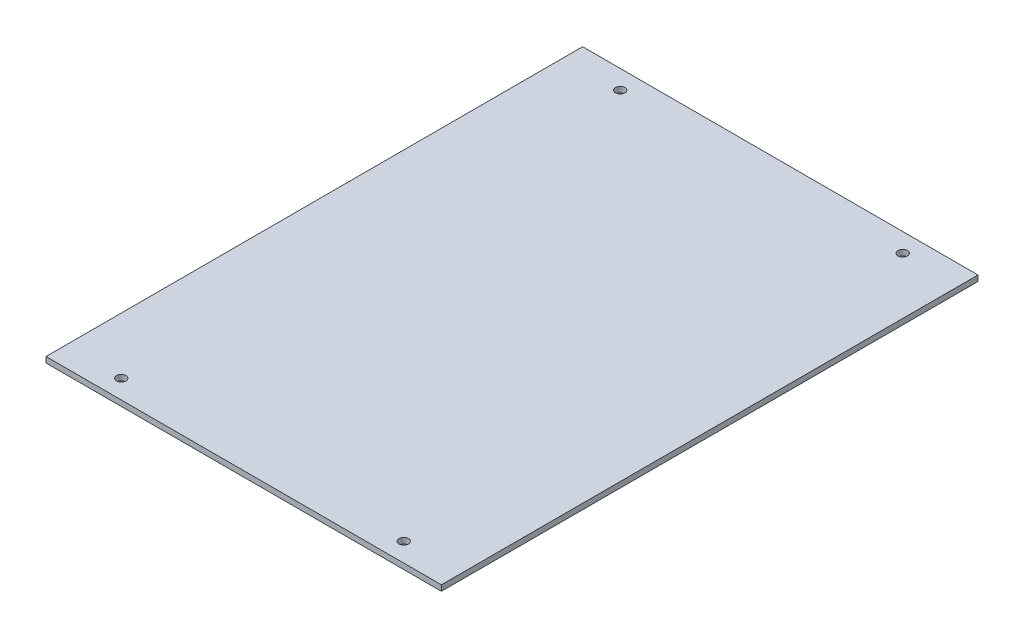
ISO-10303-21;
HEADER;
FILE_DESCRIPTION(('STEP AP214'),'2;1');
FILE_NAME('part.step','',(''),(''),'','','');
FILE_SCHEMA(('AUTOMOTIVE_DESIGN { 1 0 10303 214 1 1 1 1 }'));
ENDSEC;
DATA;
#1=APPLICATION_CONTEXT('core data for automotive mechanical design processes');
#2=APPLICATION_PROTOCOL_DEFINITION('international standard','automotive_design',2000,#1);
#3=PRODUCT_CONTEXT('',#1,'mechanical');
#4=PRODUCT('Part','Part','',(#3));
#5=PRODUCT_RELATED_PRODUCT_CATEGORY('part','',(#4));
#6=PRODUCT_DEFINITION_FORMATION('','',#4);
#7=PRODUCT_DEFINITION_CONTEXT('part definition',#1,'design');
#8=PRODUCT_DEFINITION('design','',#6,#7);
#9=PRODUCT_DEFINITION_SHAPE('','',#8);
#10=(LENGTH_UNIT() NAMED_UNIT(*) SI_UNIT(.MILLI.,.METRE.));
#11=(NAMED_UNIT(*) PLANE_ANGLE_UNIT() SI_UNIT($,.RADIAN.));
#12=(NAMED_UNIT(*) SI_UNIT($,.STERADIAN.) SOLID_ANGLE_UNIT());
#13=UNCERTAINTY_MEASURE_WITH_UNIT(LENGTH_MEASURE(1.E-05),#10,'distance_accuracy_value','');
#14=(GEOMETRIC_REPRESENTATION_CONTEXT(3) GLOBAL_UNCERTAINTY_ASSIGNED_CONTEXT((#13)) GLOBAL_UNIT_ASSIGNED_CONTEXT((#10,
#11,#12)) REPRESENTATION_CONTEXT('',''));
#15=CARTESIAN_POINT('',(0.,0.,0.));
#16=DIRECTION('',(0.,0.,1.));
#17=DIRECTION('',(1.,0.,0.));
#18=AXIS2_PLACEMENT_3D('',#15,#16,#17);
#19=CARTESIAN_POINT('',(0.,3.,0.));
#20=DIRECTION('',(0.,1.,0.));
#21=DIRECTION('',(0.,0.,1.));
#22=AXIS2_PLACEMENT_3D('',#19,#20,#21);
#23=PLANE('',#22);
#24=CARTESIAN_POINT('',(75.,3.,132.5));
#25=DIRECTION('',(0.,1.,0.));
#26=DIRECTION('',(0.,0.,1.));
#27=AXIS2_PLACEMENT_3D('',#24,#25,#26);
#28=CIRCLE('',#27,2.50000000000001);
#29=CARTESIAN_POINT('',(75.,3.,135.));
#30=VERTEX_POINT('',#29);
#31=EDGE_CURVE('E121',#30,#30,#28,.T.);
#32=ORIENTED_EDGE('',*,*,#31,.F.);
#33=EDGE_LOOP('',(#32));
#34=FACE_BOUND('',#33,.T.);
#35=CARTESIAN_POINT('',(-75.,3.,-132.5));
#36=DIRECTION('',(0.,1.,0.));
#37=DIRECTION('',(0.,0.,1.));
#38=AXIS2_PLACEMENT_3D('',#35,#36,#37);
#39=CIRCLE('',#38,2.50000000000001);
#40=CARTESIAN_POINT('',(-75.,3.,-130.));
#41=VERTEX_POINT('',#40);
#42=EDGE_CURVE('E100',#41,#41,#39,.T.);
#43=ORIENTED_EDGE('',*,*,#42,.F.);
#44=EDGE_LOOP('',(#43));
#45=FACE_BOUND('',#44,.T.);
#46=DIRECTION('',(0.,0.,-1.));
#47=VECTOR('',#46,1.);
#48=CARTESIAN_POINT('',(105.,3.,-142.5));
#49=LINE('',#48,#47);
#50=CARTESIAN_POINT('',(105.,3.,142.5));
#51=VERTEX_POINT('',#50);
#52=CARTESIAN_POINT('',(105.,3.,-142.5));
#53=VERTEX_POINT('',#52);
#54=EDGE_CURVE('E85',#51,#53,#49,.T.);
#55=ORIENTED_EDGE('',*,*,#54,.T.);
#56=DIRECTION('',(-1.,0.,0.));
#57=VECTOR('',#56,1.);
#58=CARTESIAN_POINT('',(-105.,3.,-142.5));
#59=LINE('',#58,#57);
#60=CARTESIAN_POINT('',(-105.,3.,-142.5));
#61=VERTEX_POINT('',#60);
#62=EDGE_CURVE('E80',#53,#61,#59,.T.);
#63=ORIENTED_EDGE('',*,*,#62,.T.);
#64=DIRECTION('',(0.,0.,1.));
#65=VECTOR('',#64,1.);
#66=CARTESIAN_POINT('',(-105.,3.,-142.5));
#67=LINE('',#66,#65);
#68=CARTESIAN_POINT('',(-105.,3.,142.5));
#69=VERTEX_POINT('',#68);
#70=EDGE_CURVE('E83',#61,#69,#67,.T.);
#71=ORIENTED_EDGE('',*,*,#70,.T.);
#72=DIRECTION('',(1.,0.,0.));
#73=VECTOR('',#72,1.);
#74=CARTESIAN_POINT('',(-105.,3.,142.5));
#75=LINE('',#74,#73);
#76=EDGE_CURVE('E50',#69,#51,#75,.T.);
#77=ORIENTED_EDGE('',*,*,#76,.T.);
#78=EDGE_LOOP('',(#55,#63,#71,#77));
#79=FACE_BOUND('',#78,.T.);
#80=CARTESIAN_POINT('',(-75.,3.,132.5));
#81=DIRECTION('',(0.,1.,0.));
#82=DIRECTION('',(0.,0.,-1.));
#83=AXIS2_PLACEMENT_3D('',#80,#81,#82);
#84=CIRCLE('',#83,2.50000000000001);
#85=CARTESIAN_POINT('',(-75.,3.,130.));
#86=VERTEX_POINT('',#85);
#87=EDGE_CURVE('E115',#86,#86,#84,.T.);
#88=ORIENTED_EDGE('',*,*,#87,.F.);
#89=EDGE_LOOP('',(#88));
#90=FACE_BOUND('',#89,.T.);
#91=CARTESIAN_POINT('',(75.,3.,-132.5));
#92=DIRECTION('',(0.,1.,0.));
#93=DIRECTION('',(0.,0.,-1.));
#94=AXIS2_PLACEMENT_3D('',#91,#92,#93);
#95=CIRCLE('',#94,2.50000000000001);
#96=CARTESIAN_POINT('',(75.,3.,-135.));
#97=VERTEX_POINT('',#96);
#98=EDGE_CURVE('E127',#97,#97,#95,.T.);
#99=ORIENTED_EDGE('',*,*,#98,.F.);
#100=EDGE_LOOP('',(#99));
#101=FACE_BOUND('',#100,.T.);
#102=ADVANCED_FACE('F33',(#34,#45,#79,#90,#101),#23,.T.);
#103=CARTESIAN_POINT('',(0.,0.,0.));
#104=DIRECTION('',(0.,1.,0.));
#105=DIRECTION('',(0.,0.,1.));
#106=AXIS2_PLACEMENT_3D('',#103,#104,#105);
#107=PLANE('',#106);
#108=DIRECTION('',(0.,0.,-1.));
#109=VECTOR('',#108,1.);
#110=CARTESIAN_POINT('',(105.,0.,-142.5));
#111=LINE('',#110,#109);
#112=CARTESIAN_POINT('',(105.,0.,142.5));
#113=VERTEX_POINT('',#112);
#114=CARTESIAN_POINT('',(105.,0.,-142.5));
#115=VERTEX_POINT('',#114);
#116=EDGE_CURVE('E97',#113,#115,#111,.T.);
#117=ORIENTED_EDGE('',*,*,#116,.F.);
#118=DIRECTION('',(1.,0.,0.));
#119=VECTOR('',#118,1.);
#120=CARTESIAN_POINT('',(-105.,0.,142.5));
#121=LINE('',#120,#119);
#122=CARTESIAN_POINT('',(-105.,0.,142.5));
#123=VERTEX_POINT('',#122);
#124=EDGE_CURVE('E73',#123,#113,#121,.T.);
#125=ORIENTED_EDGE('',*,*,#124,.F.);
#126=DIRECTION('',(0.,0.,1.));
#127=VECTOR('',#126,1.);
#128=CARTESIAN_POINT('',(-105.,0.,-142.5));
#129=LINE('',#128,#127);
#130=CARTESIAN_POINT('',(-105.,0.,-142.5));
#131=VERTEX_POINT('',#130);
#132=EDGE_CURVE('E67',#131,#123,#129,.T.);
#133=ORIENTED_EDGE('',*,*,#132,.F.);
#134=DIRECTION('',(-1.,0.,0.));
#135=VECTOR('',#134,1.);
#136=CARTESIAN_POINT('',(-105.,0.,-142.5));
#137=LINE('',#136,#135);
#138=EDGE_CURVE('E89',#115,#131,#137,.T.);
#139=ORIENTED_EDGE('',*,*,#138,.F.);
#140=EDGE_LOOP('',(#117,#125,#133,#139));
#141=FACE_BOUND('',#140,.T.);
#142=CARTESIAN_POINT('',(-75.,0.,-132.5));
#143=DIRECTION('',(0.,1.,0.));
#144=DIRECTION('',(0.,0.,1.));
#145=AXIS2_PLACEMENT_3D('',#142,#143,#144);
#146=CIRCLE('',#145,2.50000000000001);
#147=CARTESIAN_POINT('',(-75.,0.,-130.));
#148=VERTEX_POINT('',#147);
#149=EDGE_CURVE('E112',#148,#148,#146,.T.);
#150=ORIENTED_EDGE('',*,*,#149,.T.);
#151=EDGE_LOOP('',(#150));
#152=FACE_BOUND('',#151,.T.);
#153=CARTESIAN_POINT('',(-75.,0.,132.5));
#154=DIRECTION('',(0.,1.,0.));
#155=DIRECTION('',(0.,0.,-1.));
#156=AXIS2_PLACEMENT_3D('',#153,#154,#155);
#157=CIRCLE('',#156,2.50000000000001);
#158=CARTESIAN_POINT('',(-75.,0.,130.));
#159=VERTEX_POINT('',#158);
#160=EDGE_CURVE('E118',#159,#159,#157,.T.);
#161=ORIENTED_EDGE('',*,*,#160,.T.);
#162=EDGE_LOOP('',(#161));
#163=FACE_BOUND('',#162,.T.);
#164=CARTESIAN_POINT('',(75.,0.,132.5));
#165=DIRECTION('',(0.,1.,0.));
#166=DIRECTION('',(0.,0.,1.));
#167=AXIS2_PLACEMENT_3D('',#164,#165,#166);
#168=CIRCLE('',#167,2.50000000000001);
#169=CARTESIAN_POINT('',(75.,0.,135.));
#170=VERTEX_POINT('',#169);
#171=EDGE_CURVE('E124',#170,#170,#168,.T.);
#172=ORIENTED_EDGE('',*,*,#171,.T.);
#173=EDGE_LOOP('',(#172));
#174=FACE_BOUND('',#173,.T.);
#175=CARTESIAN_POINT('',(75.,0.,-132.5));
#176=DIRECTION('',(0.,1.,0.));
#177=DIRECTION('',(0.,0.,-1.));
#178=AXIS2_PLACEMENT_3D('',#175,#176,#177);
#179=CIRCLE('',#178,2.50000000000001);
#180=CARTESIAN_POINT('',(75.,0.,-135.));
#181=VERTEX_POINT('',#180);
#182=EDGE_CURVE('E130',#181,#181,#179,.T.);
#183=ORIENTED_EDGE('',*,*,#182,.T.);
#184=EDGE_LOOP('',(#183));
#185=FACE_BOUND('',#184,.T.);
#186=ADVANCED_FACE('F108',(#141,#152,#163,#174,#185),#107,.F.);
#187=CARTESIAN_POINT('',(105.,3.,-142.5));
#188=DIRECTION('',(-1.,0.,0.));
#189=DIRECTION('',(0.,0.,1.));
#190=AXIS2_PLACEMENT_3D('',#187,#188,#189);
#191=PLANE('',#190);
#192=ORIENTED_EDGE('',*,*,#116,.T.);
#193=DIRECTION('',(0.,-1.,0.));
#194=VECTOR('',#193,1.);
#195=CARTESIAN_POINT('',(105.,3.,-142.5));
#196=LINE('',#195,#194);
#197=EDGE_CURVE('E11',#53,#115,#196,.T.);
#198=ORIENTED_EDGE('',*,*,#197,.F.);
#199=ORIENTED_EDGE('',*,*,#54,.F.);
#200=DIRECTION('',(0.,-1.,0.));
#201=VECTOR('',#200,1.);
#202=CARTESIAN_POINT('',(105.,3.,142.5));
#203=LINE('',#202,#201);
#204=EDGE_CURVE('E93',#51,#113,#203,.T.);
#205=ORIENTED_EDGE('',*,*,#204,.T.);
#206=EDGE_LOOP('',(#192,#198,#199,#205));
#207=FACE_BOUND('',#206,.T.);
#208=ADVANCED_FACE('F35',(#207),#191,.F.);
#209=CARTESIAN_POINT('',(-105.,3.,-142.5));
#210=DIRECTION('',(0.,0.,1.));
#211=DIRECTION('',(1.,0.,0.));
#212=AXIS2_PLACEMENT_3D('',#209,#210,#211);
#213=PLANE('',#212);
#214=ORIENTED_EDGE('',*,*,#138,.T.);
#215=DIRECTION('',(0.,-1.,0.));
#216=VECTOR('',#215,1.);
#217=CARTESIAN_POINT('',(-105.,3.,-142.5));
#218=LINE('',#217,#216);
#219=EDGE_CURVE('E42',#61,#131,#218,.T.);
#220=ORIENTED_EDGE('',*,*,#219,.F.);
#221=ORIENTED_EDGE('',*,*,#62,.F.);
#222=ORIENTED_EDGE('',*,*,#197,.T.);
#223=EDGE_LOOP('',(#214,#220,#221,#222));
#224=FACE_BOUND('',#223,.T.);
#225=ADVANCED_FACE('F88',(#224),#213,.F.);
#226=CARTESIAN_POINT('',(-105.,3.,-142.5));
#227=DIRECTION('',(1.,0.,0.));
#228=DIRECTION('',(0.,0.,-1.));
#229=AXIS2_PLACEMENT_3D('',#226,#227,#228);
#230=PLANE('',#229);
#231=ORIENTED_EDGE('',*,*,#132,.T.);
#232=DIRECTION('',(0.,-1.,0.));
#233=VECTOR('',#232,1.);
#234=CARTESIAN_POINT('',(-105.,3.,142.5));
#235=LINE('',#234,#233);
#236=EDGE_CURVE('E90',#69,#123,#235,.T.);
#237=ORIENTED_EDGE('',*,*,#236,.F.);
#238=ORIENTED_EDGE('',*,*,#70,.F.);
#239=ORIENTED_EDGE('',*,*,#219,.T.);
#240=EDGE_LOOP('',(#231,#237,#238,#239));
#241=FACE_BOUND('',#240,.T.);
#242=ADVANCED_FACE('F91',(#241),#230,.F.);
#243=CARTESIAN_POINT('',(-105.,3.,142.5));
#244=DIRECTION('',(0.,0.,-1.));
#245=DIRECTION('',(-1.,0.,0.));
#246=AXIS2_PLACEMENT_3D('',#243,#244,#245);
#247=PLANE('',#246);
#248=ORIENTED_EDGE('',*,*,#124,.T.);
#249=ORIENTED_EDGE('',*,*,#204,.F.);
#250=ORIENTED_EDGE('',*,*,#76,.F.);
#251=ORIENTED_EDGE('',*,*,#236,.T.);
#252=EDGE_LOOP('',(#248,#249,#250,#251));
#253=FACE_BOUND('',#252,.T.);
#254=ADVANCED_FACE('F105',(#253),#247,.F.);
#255=CARTESIAN_POINT('',(-75.,3.,-132.5));
#256=DIRECTION('',(0.,-1.,0.));
#257=DIRECTION('',(0.,0.,-1.));
#258=AXIS2_PLACEMENT_3D('',#255,#256,#257);
#259=CYLINDRICAL_SURFACE('',#258,2.50000000000001);
#260=ORIENTED_EDGE('',*,*,#42,.T.);
#261=EDGE_LOOP('',(#260));
#262=FACE_BOUND('',#261,.T.);
#263=ORIENTED_EDGE('',*,*,#149,.F.);
#264=EDGE_LOOP('',(#263));
#265=FACE_BOUND('',#264,.T.);
#266=ADVANCED_FACE('F149',(#262,#265),#259,.F.);
#267=CARTESIAN_POINT('',(-75.,3.,132.5));
#268=DIRECTION('',(0.,-1.,0.));
#269=DIRECTION('',(0.,0.,-1.));
#270=AXIS2_PLACEMENT_3D('',#267,#268,#269);
#271=CYLINDRICAL_SURFACE('',#270,2.50000000000001);
#272=ORIENTED_EDGE('',*,*,#87,.T.);
#273=EDGE_LOOP('',(#272));
#274=FACE_BOUND('',#273,.T.);
#275=ORIENTED_EDGE('',*,*,#160,.F.);
#276=EDGE_LOOP('',(#275));
#277=FACE_BOUND('',#276,.T.);
#278=ADVANCED_FACE('F195',(#274,#277),#271,.F.);
#279=CARTESIAN_POINT('',(75.,3.,132.5));
#280=DIRECTION('',(0.,-1.,0.));
#281=DIRECTION('',(0.,0.,-1.));
#282=AXIS2_PLACEMENT_3D('',#279,#280,#281);
#283=CYLINDRICAL_SURFACE('',#282,2.50000000000001);
#284=ORIENTED_EDGE('',*,*,#31,.T.);
#285=EDGE_LOOP('',(#284));
#286=FACE_BOUND('',#285,.T.);
#287=ORIENTED_EDGE('',*,*,#171,.F.);
#288=EDGE_LOOP('',(#287));
#289=FACE_BOUND('',#288,.T.);
#290=ADVANCED_FACE('F203',(#286,#289),#283,.F.);
#291=CARTESIAN_POINT('',(75.,3.,-132.5));
#292=DIRECTION('',(0.,-1.,0.));
#293=DIRECTION('',(0.,0.,-1.));
#294=AXIS2_PLACEMENT_3D('',#291,#292,#293);
#295=CYLINDRICAL_SURFACE('',#294,2.50000000000001);
#296=ORIENTED_EDGE('',*,*,#98,.T.);
#297=EDGE_LOOP('',(#296));
#298=FACE_BOUND('',#297,.T.);
#299=ORIENTED_EDGE('',*,*,#182,.F.);
#300=EDGE_LOOP('',(#299));
#301=FACE_BOUND('',#300,.T.);
#302=ADVANCED_FACE('F136',(#298,#301),#295,.F.);
#303=CLOSED_SHELL('',(#102,#186,#208,#225,#242,#254,#266,#278,#290,#302));
#304=MANIFOLD_SOLID_BREP('B2',#303);
#305=ADVANCED_BREP_SHAPE_REPRESENTATION('',(#18,#304),#14);
#306=SHAPE_DEFINITION_REPRESENTATION(#9,#305);
ENDSEC;
END-ISO-10303-21;
